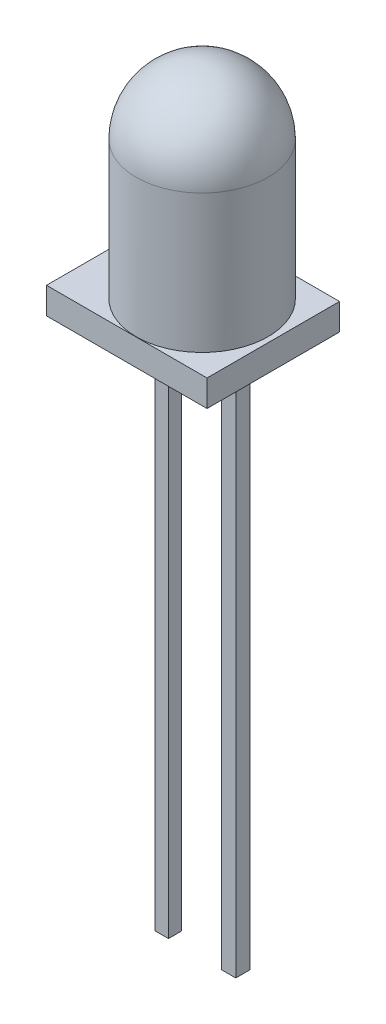
ISO-10303-21;
HEADER;
FILE_DESCRIPTION(('STEP AP214'),'2;1');
FILE_NAME('part.step','',(''),(''),'','','');
FILE_SCHEMA(('AUTOMOTIVE_DESIGN { 1 0 10303 214 1 1 1 1 }'));
ENDSEC;
DATA;
#1=APPLICATION_CONTEXT('core data for automotive mechanical design processes');
#2=APPLICATION_PROTOCOL_DEFINITION('international standard','automotive_design',2000,#1);
#3=PRODUCT_CONTEXT('',#1,'mechanical');
#4=PRODUCT('Part','Part','',(#3));
#5=PRODUCT_RELATED_PRODUCT_CATEGORY('part','',(#4));
#6=PRODUCT_DEFINITION_FORMATION('','',#4);
#7=PRODUCT_DEFINITION_CONTEXT('part definition',#1,'design');
#8=PRODUCT_DEFINITION('design','',#6,#7);
#9=PRODUCT_DEFINITION_SHAPE('','',#8);
#10=(LENGTH_UNIT() NAMED_UNIT(*) SI_UNIT(.MILLI.,.METRE.));
#11=(NAMED_UNIT(*) PLANE_ANGLE_UNIT() SI_UNIT($,.RADIAN.));
#12=(NAMED_UNIT(*) SI_UNIT($,.STERADIAN.) SOLID_ANGLE_UNIT());
#13=UNCERTAINTY_MEASURE_WITH_UNIT(LENGTH_MEASURE(1.E-05),#10,'distance_accuracy_value','');
#14=(GEOMETRIC_REPRESENTATION_CONTEXT(3) GLOBAL_UNCERTAINTY_ASSIGNED_CONTEXT((#13)) GLOBAL_UNIT_ASSIGNED_CONTEXT((#10,
#11,#12)) REPRESENTATION_CONTEXT('',''));
#15=CARTESIAN_POINT('',(0.,0.,0.));
#16=DIRECTION('',(0.,0.,1.));
#17=DIRECTION('',(1.,0.,0.));
#18=AXIS2_PLACEMENT_3D('',#15,#16,#17);
#19=CARTESIAN_POINT('',(2.68454649304317,-6.21,-2.5));
#20=DIRECTION('',(0.,-1.,0.));
#21=DIRECTION('',(1.,0.,0.));
#22=AXIS2_PLACEMENT_3D('',#19,#20,#21);
#23=PLANE('',#22);
#24=DIRECTION('',(1.,0.,0.));
#25=VECTOR('',#24,1.);
#26=CARTESIAN_POINT('',(2.68454649304317,-6.21,2.5));
#27=LINE('',#26,#25);
#28=CARTESIAN_POINT('',(-3.37328174981621,-6.21,2.5));
#29=VERTEX_POINT('',#28);
#30=CARTESIAN_POINT('',(2.68454649304317,-6.21,2.5));
#31=VERTEX_POINT('',#30);
#32=EDGE_CURVE('E186',#29,#31,#27,.T.);
#33=ORIENTED_EDGE('',*,*,#32,.F.);
#34=DIRECTION('',(0.,0.,1.));
#35=VECTOR('',#34,1.);
#36=CARTESIAN_POINT('',(-3.37328174981621,-6.21,-2.5));
#37=LINE('',#36,#35);
#38=CARTESIAN_POINT('',(-3.37328174981621,-6.21,-2.5));
#39=VERTEX_POINT('',#38);
#40=EDGE_CURVE('E208',#39,#29,#37,.T.);
#41=ORIENTED_EDGE('',*,*,#40,.F.);
#42=DIRECTION('',(1.,0.,0.));
#43=VECTOR('',#42,1.);
#44=CARTESIAN_POINT('',(2.68454649304317,-6.21,-2.5));
#45=LINE('',#44,#43);
#46=CARTESIAN_POINT('',(2.68454649304317,-6.21,-2.5));
#47=VERTEX_POINT('',#46);
#48=EDGE_CURVE('E192',#39,#47,#45,.T.);
#49=ORIENTED_EDGE('',*,*,#48,.T.);
#50=DIRECTION('',(0.,0.,1.));
#51=VECTOR('',#50,1.);
#52=CARTESIAN_POINT('',(2.68454649304317,-6.21,-2.5));
#53=LINE('',#52,#51);
#54=EDGE_CURVE('E206',#47,#31,#53,.T.);
#55=ORIENTED_EDGE('',*,*,#54,.T.);
#56=EDGE_LOOP('',(#33,#41,#49,#55));
#57=FACE_BOUND('',#56,.T.);
#58=DIRECTION('',(-1.,0.,0.));
#59=VECTOR('',#58,1.);
#60=CARTESIAN_POINT('',(-1.52,-6.21,0.25));
#61=LINE('',#60,#59);
#62=CARTESIAN_POINT('',(-1.02,-6.21,0.25));
#63=VERTEX_POINT('',#62);
#64=CARTESIAN_POINT('',(-1.52,-6.21,0.25));
#65=VERTEX_POINT('',#64);
#66=EDGE_CURVE('E153',#63,#65,#61,.T.);
#67=ORIENTED_EDGE('',*,*,#66,.F.);
#68=DIRECTION('',(0.,0.,1.));
#69=VECTOR('',#68,1.);
#70=CARTESIAN_POINT('',(-1.02,-6.21,-0.25));
#71=LINE('',#70,#69);
#72=CARTESIAN_POINT('',(-1.02,-6.21,-0.25));
#73=VERTEX_POINT('',#72);
#74=EDGE_CURVE('E150',#73,#63,#71,.T.);
#75=ORIENTED_EDGE('',*,*,#74,.F.);
#76=DIRECTION('',(1.,0.,0.));
#77=VECTOR('',#76,1.);
#78=CARTESIAN_POINT('',(-1.52,-6.21,-0.25));
#79=LINE('',#78,#77);
#80=CARTESIAN_POINT('',(-1.52,-6.21,-0.25));
#81=VERTEX_POINT('',#80);
#82=EDGE_CURVE('E162',#81,#73,#79,.T.);
#83=ORIENTED_EDGE('',*,*,#82,.F.);
#84=DIRECTION('',(0.,0.,-1.));
#85=VECTOR('',#84,1.);
#86=CARTESIAN_POINT('',(-1.52,-6.21,-0.25));
#87=LINE('',#86,#85);
#88=EDGE_CURVE('E170',#65,#81,#87,.T.);
#89=ORIENTED_EDGE('',*,*,#88,.F.);
#90=EDGE_LOOP('',(#67,#75,#83,#89));
#91=FACE_BOUND('',#90,.T.);
#92=DIRECTION('',(-1.,0.,0.));
#93=VECTOR('',#92,1.);
#94=CARTESIAN_POINT('',(1.00217363423916,-6.21,0.267826365760837));
#95=LINE('',#94,#93);
#96=CARTESIAN_POINT('',(1.53782636576084,-6.21,0.267826365760837));
#97=VERTEX_POINT('',#96);
#98=CARTESIAN_POINT('',(1.00217363423916,-6.21,0.267826365760837));
#99=VERTEX_POINT('',#98);
#100=EDGE_CURVE('E395',#97,#99,#95,.T.);
#101=ORIENTED_EDGE('',*,*,#100,.F.);
#102=DIRECTION('',(0.,0.,1.));
#103=VECTOR('',#102,1.);
#104=CARTESIAN_POINT('',(1.53782636576084,-6.21,-0.267826365760837));
#105=LINE('',#104,#103);
#106=CARTESIAN_POINT('',(1.53782636576084,-6.21,-0.267826365760837));
#107=VERTEX_POINT('',#106);
#108=EDGE_CURVE('E148',#107,#97,#105,.T.);
#109=ORIENTED_EDGE('',*,*,#108,.F.);
#110=DIRECTION('',(1.,0.,0.));
#111=VECTOR('',#110,1.);
#112=CARTESIAN_POINT('',(1.00217363423916,-6.21,-0.267826365760837));
#113=LINE('',#112,#111);
#114=CARTESIAN_POINT('',(1.00217363423916,-6.21,-0.267826365760837));
#115=VERTEX_POINT('',#114);
#116=EDGE_CURVE('E144',#115,#107,#113,.T.);
#117=ORIENTED_EDGE('',*,*,#116,.F.);
#118=DIRECTION('',(0.,0.,-1.));
#119=VECTOR('',#118,1.);
#120=CARTESIAN_POINT('',(1.00217363423916,-6.21,-0.267826365760837));
#121=LINE('',#120,#119);
#122=EDGE_CURVE('E392',#99,#115,#121,.T.);
#123=ORIENTED_EDGE('',*,*,#122,.F.);
#124=EDGE_LOOP('',(#101,#109,#117,#123));
#125=FACE_BOUND('',#124,.T.);
#126=ADVANCED_FACE('F35',(#57,#91,#125),#23,.T.);
#127=CARTESIAN_POINT('',(0.,2.49,0.));
#128=DIRECTION('',(0.,1.,0.));
#129=DIRECTION('',(-1.,0.,0.));
#130=AXIS2_PLACEMENT_3D('',#127,#128,#129);
#131=CYLINDRICAL_SURFACE('',#130,2.49);
#132=CARTESIAN_POINT('',(0.,-5.21,0.));
#133=DIRECTION('',(0.,1.,0.));
#134=DIRECTION('',(-1.,0.,0.));
#135=AXIS2_PLACEMENT_3D('',#132,#133,#134);
#136=CIRCLE('',#135,2.49);
#137=CARTESIAN_POINT('',(-2.49,-5.21,0.));
#138=VERTEX_POINT('',#137);
#139=EDGE_CURVE('E43',#138,#138,#136,.F.);
#140=ORIENTED_EDGE('',*,*,#139,.F.);
#141=EDGE_LOOP('',(#140));
#142=FACE_BOUND('',#141,.T.);
#143=CARTESIAN_POINT('',(0.,0.,0.));
#144=DIRECTION('',(0.,1.,0.));
#145=DIRECTION('',(-1.,0.,0.));
#146=AXIS2_PLACEMENT_3D('',#143,#144,#145);
#147=CIRCLE('',#146,2.49);
#148=CARTESIAN_POINT('',(-2.48999999999999,0.,0.));
#149=VERTEX_POINT('',#148);
#150=EDGE_CURVE('E11',#149,#149,#147,.T.);
#151=ORIENTED_EDGE('',*,*,#150,.F.);
#152=EDGE_LOOP('',(#151));
#153=FACE_BOUND('',#152,.T.);
#154=ADVANCED_FACE('F37',(#142,#153),#131,.T.);
#155=CARTESIAN_POINT('',(0.,0.,0.));
#156=DIRECTION('',(0.,1.,0.));
#157=DIRECTION('',(1.,0.,0.));
#158=AXIS2_PLACEMENT_3D('',#155,#156,#157);
#159=SPHERICAL_SURFACE('',#158,2.49);
#160=ORIENTED_EDGE('',*,*,#150,.T.);
#161=EDGE_LOOP('',(#160));
#162=FACE_BOUND('',#161,.T.);
#163=ADVANCED_FACE('F220',(#162),#159,.T.);
#164=CARTESIAN_POINT('',(2.68454649304317,-5.21,-2.5));
#165=DIRECTION('',(1.,0.,0.));
#166=DIRECTION('',(0.,0.,-1.));
#167=AXIS2_PLACEMENT_3D('',#164,#165,#166);
#168=PLANE('',#167);
#169=DIRECTION('',(0.,1.,0.));
#170=VECTOR('',#169,1.);
#171=CARTESIAN_POINT('',(2.68454649304317,-5.21,2.5));
#172=LINE('',#171,#170);
#173=CARTESIAN_POINT('',(2.68454649304317,-5.21,2.5));
#174=VERTEX_POINT('',#173);
#175=EDGE_CURVE('E181',#31,#174,#172,.T.);
#176=ORIENTED_EDGE('',*,*,#175,.F.);
#177=ORIENTED_EDGE('',*,*,#54,.F.);
#178=DIRECTION('',(0.,1.,0.));
#179=VECTOR('',#178,1.);
#180=CARTESIAN_POINT('',(2.68454649304317,-5.21,-2.5));
#181=LINE('',#180,#179);
#182=CARTESIAN_POINT('',(2.68454649304317,-5.21,-2.5));
#183=VERTEX_POINT('',#182);
#184=EDGE_CURVE('E182',#47,#183,#181,.T.);
#185=ORIENTED_EDGE('',*,*,#184,.T.);
#186=DIRECTION('',(0.,0.,1.));
#187=VECTOR('',#186,1.);
#188=CARTESIAN_POINT('',(2.68454649304317,-5.21,-2.5));
#189=LINE('',#188,#187);
#190=EDGE_CURVE('E195',#183,#174,#189,.T.);
#191=ORIENTED_EDGE('',*,*,#190,.T.);
#192=EDGE_LOOP('',(#176,#177,#185,#191));
#193=FACE_BOUND('',#192,.T.);
#194=ADVANCED_FACE('F224',(#193),#168,.T.);
#195=CARTESIAN_POINT('',(-3.37328174981621,-5.21,-2.5));
#196=DIRECTION('',(-1.,0.,0.));
#197=DIRECTION('',(0.,0.,1.));
#198=AXIS2_PLACEMENT_3D('',#195,#196,#197);
#199=PLANE('',#198);
#200=DIRECTION('',(0.,-1.,0.));
#201=VECTOR('',#200,1.);
#202=CARTESIAN_POINT('',(-3.37328174981621,-5.21,2.5));
#203=LINE('',#202,#201);
#204=CARTESIAN_POINT('',(-3.37328174981621,-5.21,2.5));
#205=VERTEX_POINT('',#204);
#206=EDGE_CURVE('E201',#205,#29,#203,.T.);
#207=ORIENTED_EDGE('',*,*,#206,.F.);
#208=DIRECTION('',(0.,0.,1.));
#209=VECTOR('',#208,1.);
#210=CARTESIAN_POINT('',(-3.37328174981621,-5.21,-2.5));
#211=LINE('',#210,#209);
#212=CARTESIAN_POINT('',(-3.37328174981621,-5.21,-2.5));
#213=VERTEX_POINT('',#212);
#214=EDGE_CURVE('E210',#213,#205,#211,.T.);
#215=ORIENTED_EDGE('',*,*,#214,.F.);
#216=DIRECTION('',(0.,-1.,0.));
#217=VECTOR('',#216,1.);
#218=CARTESIAN_POINT('',(-3.37328174981621,-5.21,-2.5));
#219=LINE('',#218,#217);
#220=EDGE_CURVE('E189',#213,#39,#219,.T.);
#221=ORIENTED_EDGE('',*,*,#220,.T.);
#222=ORIENTED_EDGE('',*,*,#40,.T.);
#223=EDGE_LOOP('',(#207,#215,#221,#222));
#224=FACE_BOUND('',#223,.T.);
#225=ADVANCED_FACE('F228',(#224),#199,.T.);
#226=CARTESIAN_POINT('',(2.68454649304317,-5.21,-2.5));
#227=DIRECTION('',(0.,1.,0.));
#228=DIRECTION('',(-1.,0.,0.));
#229=AXIS2_PLACEMENT_3D('',#226,#227,#228);
#230=PLANE('',#229);
#231=ORIENTED_EDGE('',*,*,#139,.T.);
#232=EDGE_LOOP('',(#231));
#233=FACE_BOUND('',#232,.T.);
#234=DIRECTION('',(-1.,0.,0.));
#235=VECTOR('',#234,1.);
#236=CARTESIAN_POINT('',(2.68454649304317,-5.21,2.5));
#237=LINE('',#236,#235);
#238=EDGE_CURVE('E198',#174,#205,#237,.T.);
#239=ORIENTED_EDGE('',*,*,#238,.F.);
#240=ORIENTED_EDGE('',*,*,#190,.F.);
#241=DIRECTION('',(-1.,0.,0.));
#242=VECTOR('',#241,1.);
#243=CARTESIAN_POINT('',(2.68454649304317,-5.21,-2.5));
#244=LINE('',#243,#242);
#245=EDGE_CURVE('E185',#183,#213,#244,.T.);
#246=ORIENTED_EDGE('',*,*,#245,.T.);
#247=ORIENTED_EDGE('',*,*,#214,.T.);
#248=EDGE_LOOP('',(#239,#240,#246,#247));
#249=FACE_BOUND('',#248,.T.);
#250=ADVANCED_FACE('F215',(#233,#249),#230,.T.);
#251=CARTESIAN_POINT('',(0.,0.,-2.5));
#252=DIRECTION('',(0.,0.,-1.));
#253=DIRECTION('',(-1.,0.,0.));
#254=AXIS2_PLACEMENT_3D('',#251,#252,#253);
#255=PLANE('',#254);
#256=ORIENTED_EDGE('',*,*,#184,.F.);
#257=ORIENTED_EDGE('',*,*,#48,.F.);
#258=ORIENTED_EDGE('',*,*,#220,.F.);
#259=ORIENTED_EDGE('',*,*,#245,.F.);
#260=EDGE_LOOP('',(#256,#257,#258,#259));
#261=FACE_BOUND('',#260,.T.);
#262=ADVANCED_FACE('F246',(#261),#255,.T.);
#263=CARTESIAN_POINT('',(0.,0.,2.5));
#264=DIRECTION('',(0.,0.,-1.));
#265=DIRECTION('',(-1.,0.,0.));
#266=AXIS2_PLACEMENT_3D('',#263,#264,#265);
#267=PLANE('',#266);
#268=ORIENTED_EDGE('',*,*,#175,.T.);
#269=ORIENTED_EDGE('',*,*,#238,.T.);
#270=ORIENTED_EDGE('',*,*,#206,.T.);
#271=ORIENTED_EDGE('',*,*,#32,.T.);
#272=EDGE_LOOP('',(#268,#269,#270,#271));
#273=FACE_BOUND('',#272,.T.);
#274=ADVANCED_FACE('F240',(#273),#267,.F.);
#275=CARTESIAN_POINT('',(-1.02,-26.51,-0.25));
#276=DIRECTION('',(-1.,0.,0.));
#277=DIRECTION('',(0.,-1.,0.));
#278=AXIS2_PLACEMENT_3D('',#275,#276,#277);
#279=PLANE('',#278);
#280=ORIENTED_EDGE('',*,*,#74,.T.);
#281=DIRECTION('',(0.,1.,0.));
#282=VECTOR('',#281,1.);
#283=CARTESIAN_POINT('',(-1.02,-26.51,0.25));
#284=LINE('',#283,#282);
#285=CARTESIAN_POINT('',(-1.02,-26.51,0.25));
#286=VERTEX_POINT('',#285);
#287=EDGE_CURVE('E179',#286,#63,#284,.T.);
#288=ORIENTED_EDGE('',*,*,#287,.F.);
#289=DIRECTION('',(0.,0.,1.));
#290=VECTOR('',#289,1.);
#291=CARTESIAN_POINT('',(-1.02,-26.51,-0.25));
#292=LINE('',#291,#290);
#293=CARTESIAN_POINT('',(-1.02,-26.51,-0.25));
#294=VERTEX_POINT('',#293);
#295=EDGE_CURVE('E158',#294,#286,#292,.T.);
#296=ORIENTED_EDGE('',*,*,#295,.F.);
#297=DIRECTION('',(0.,1.,0.));
#298=VECTOR('',#297,1.);
#299=CARTESIAN_POINT('',(-1.02,-26.51,-0.25));
#300=LINE('',#299,#298);
#301=EDGE_CURVE('E167',#294,#73,#300,.T.);
#302=ORIENTED_EDGE('',*,*,#301,.T.);
#303=EDGE_LOOP('',(#280,#288,#296,#302));
#304=FACE_BOUND('',#303,.T.);
#305=ADVANCED_FACE('F254',(#304),#279,.F.);
#306=CARTESIAN_POINT('',(-1.52,-26.51,0.25));
#307=DIRECTION('',(0.,0.,-1.));
#308=DIRECTION('',(-1.,0.,0.));
#309=AXIS2_PLACEMENT_3D('',#306,#307,#308);
#310=PLANE('',#309);
#311=ORIENTED_EDGE('',*,*,#66,.T.);
#312=DIRECTION('',(0.,1.,0.));
#313=VECTOR('',#312,1.);
#314=CARTESIAN_POINT('',(-1.52,-26.51,0.25));
#315=LINE('',#314,#313);
#316=CARTESIAN_POINT('',(-1.52,-26.51,0.25));
#317=VERTEX_POINT('',#316);
#318=EDGE_CURVE('E176',#317,#65,#315,.T.);
#319=ORIENTED_EDGE('',*,*,#318,.F.);
#320=DIRECTION('',(-1.,0.,0.));
#321=VECTOR('',#320,1.);
#322=CARTESIAN_POINT('',(-1.52,-26.51,0.25));
#323=LINE('',#322,#321);
#324=EDGE_CURVE('E161',#286,#317,#323,.T.);
#325=ORIENTED_EDGE('',*,*,#324,.F.);
#326=ORIENTED_EDGE('',*,*,#287,.T.);
#327=EDGE_LOOP('',(#311,#319,#325,#326));
#328=FACE_BOUND('',#327,.T.);
#329=ADVANCED_FACE('F260',(#328),#310,.F.);
#330=CARTESIAN_POINT('',(-1.52,-26.51,-0.25));
#331=DIRECTION('',(1.,0.,0.));
#332=DIRECTION('',(0.,1.,0.));
#333=AXIS2_PLACEMENT_3D('',#330,#331,#332);
#334=PLANE('',#333);
#335=ORIENTED_EDGE('',*,*,#88,.T.);
#336=DIRECTION('',(0.,1.,0.));
#337=VECTOR('',#336,1.);
#338=CARTESIAN_POINT('',(-1.52,-26.51,-0.25));
#339=LINE('',#338,#337);
#340=CARTESIAN_POINT('',(-1.52,-26.51,-0.25));
#341=VERTEX_POINT('',#340);
#342=EDGE_CURVE('E58',#341,#81,#339,.T.);
#343=ORIENTED_EDGE('',*,*,#342,.F.);
#344=DIRECTION('',(0.,0.,-1.));
#345=VECTOR('',#344,1.);
#346=CARTESIAN_POINT('',(-1.52,-26.51,-0.25));
#347=LINE('',#346,#345);
#348=EDGE_CURVE('E164',#317,#341,#347,.T.);
#349=ORIENTED_EDGE('',*,*,#348,.F.);
#350=ORIENTED_EDGE('',*,*,#318,.T.);
#351=EDGE_LOOP('',(#335,#343,#349,#350));
#352=FACE_BOUND('',#351,.T.);
#353=ADVANCED_FACE('F264',(#352),#334,.F.);
#354=CARTESIAN_POINT('',(-1.52,-26.51,-0.25));
#355=DIRECTION('',(0.,0.,1.));
#356=DIRECTION('',(1.,0.,0.));
#357=AXIS2_PLACEMENT_3D('',#354,#355,#356);
#358=PLANE('',#357);
#359=ORIENTED_EDGE('',*,*,#82,.T.);
#360=ORIENTED_EDGE('',*,*,#301,.F.);
#361=DIRECTION('',(1.,0.,0.));
#362=VECTOR('',#361,1.);
#363=CARTESIAN_POINT('',(-1.52,-26.51,-0.25));
#364=LINE('',#363,#362);
#365=EDGE_CURVE('E166',#341,#294,#364,.T.);
#366=ORIENTED_EDGE('',*,*,#365,.F.);
#367=ORIENTED_EDGE('',*,*,#342,.T.);
#368=EDGE_LOOP('',(#359,#360,#366,#367));
#369=FACE_BOUND('',#368,.T.);
#370=ADVANCED_FACE('F268',(#369),#358,.F.);
#371=CARTESIAN_POINT('',(0.,-26.51,0.));
#372=DIRECTION('',(0.,1.,0.));
#373=DIRECTION('',(0.,0.,1.));
#374=AXIS2_PLACEMENT_3D('',#371,#372,#373);
#375=PLANE('',#374);
#376=ORIENTED_EDGE('',*,*,#295,.T.);
#377=ORIENTED_EDGE('',*,*,#324,.T.);
#378=ORIENTED_EDGE('',*,*,#348,.T.);
#379=ORIENTED_EDGE('',*,*,#365,.T.);
#380=EDGE_LOOP('',(#376,#377,#378,#379));
#381=FACE_BOUND('',#380,.T.);
#382=ADVANCED_FACE('F272',(#381),#375,.F.);
#383=CARTESIAN_POINT('',(1.53782636576084,-26.51,-0.267826365760837));
#384=DIRECTION('',(-1.,0.,0.));
#385=DIRECTION('',(0.,-1.,0.));
#386=AXIS2_PLACEMENT_3D('',#383,#384,#385);
#387=PLANE('',#386);
#388=ORIENTED_EDGE('',*,*,#108,.T.);
#389=DIRECTION('',(0.,1.,0.));
#390=VECTOR('',#389,1.);
#391=CARTESIAN_POINT('',(1.53782636576084,-26.51,0.267826365760837));
#392=LINE('',#391,#390);
#393=CARTESIAN_POINT('',(1.53782636576084,-26.51,0.267826365760837));
#394=VERTEX_POINT('',#393);
#395=EDGE_CURVE('E129',#394,#97,#392,.T.);
#396=ORIENTED_EDGE('',*,*,#395,.F.);
#397=DIRECTION('',(0.,0.,1.));
#398=VECTOR('',#397,1.);
#399=CARTESIAN_POINT('',(1.53782636576084,-26.51,-0.267826365760837));
#400=LINE('',#399,#398);
#401=CARTESIAN_POINT('',(1.53782636576084,-26.51,-0.267826365760837));
#402=VERTEX_POINT('',#401);
#403=EDGE_CURVE('E136',#402,#394,#400,.T.);
#404=ORIENTED_EDGE('',*,*,#403,.F.);
#405=DIRECTION('',(0.,1.,0.));
#406=VECTOR('',#405,1.);
#407=CARTESIAN_POINT('',(1.53782636576084,-26.51,-0.267826365760837));
#408=LINE('',#407,#406);
#409=EDGE_CURVE('E389',#402,#107,#408,.T.);
#410=ORIENTED_EDGE('',*,*,#409,.T.);
#411=EDGE_LOOP('',(#388,#396,#404,#410));
#412=FACE_BOUND('',#411,.T.);
#413=ADVANCED_FACE('F146',(#412),#387,.F.);
#414=CARTESIAN_POINT('',(1.00217363423917,-26.51,0.267826365760837));
#415=DIRECTION('',(0.,0.,-1.));
#416=DIRECTION('',(-1.,0.,0.));
#417=AXIS2_PLACEMENT_3D('',#414,#415,#416);
#418=PLANE('',#417);
#419=ORIENTED_EDGE('',*,*,#100,.T.);
#420=DIRECTION('',(0.,1.,0.));
#421=VECTOR('',#420,1.);
#422=CARTESIAN_POINT('',(1.00217363423917,-26.51,0.267826365760837));
#423=LINE('',#422,#421);
#424=CARTESIAN_POINT('',(1.00217363423917,-26.51,0.267826365760837));
#425=VERTEX_POINT('',#424);
#426=EDGE_CURVE('E132',#425,#99,#423,.T.);
#427=ORIENTED_EDGE('',*,*,#426,.F.);
#428=DIRECTION('',(-1.,0.,0.));
#429=VECTOR('',#428,1.);
#430=CARTESIAN_POINT('',(1.00217363423917,-26.51,0.267826365760837));
#431=LINE('',#430,#429);
#432=EDGE_CURVE('E125',#394,#425,#431,.T.);
#433=ORIENTED_EDGE('',*,*,#432,.F.);
#434=ORIENTED_EDGE('',*,*,#395,.T.);
#435=EDGE_LOOP('',(#419,#427,#433,#434));
#436=FACE_BOUND('',#435,.T.);
#437=ADVANCED_FACE('F127',(#436),#418,.F.);
#438=CARTESIAN_POINT('',(1.00217363423917,-26.51,-0.267826365760837));
#439=DIRECTION('',(1.,0.,0.));
#440=DIRECTION('',(0.,1.,0.));
#441=AXIS2_PLACEMENT_3D('',#438,#439,#440);
#442=PLANE('',#441);
#443=ORIENTED_EDGE('',*,*,#122,.T.);
#444=DIRECTION('',(0.,1.,0.));
#445=VECTOR('',#444,1.);
#446=CARTESIAN_POINT('',(1.00217363423917,-26.51,-0.267826365760837));
#447=LINE('',#446,#445);
#448=CARTESIAN_POINT('',(1.00217363423917,-26.51,-0.267826365760837));
#449=VERTEX_POINT('',#448);
#450=EDGE_CURVE('E50',#449,#115,#447,.T.);
#451=ORIENTED_EDGE('',*,*,#450,.F.);
#452=DIRECTION('',(0.,0.,-1.));
#453=VECTOR('',#452,1.);
#454=CARTESIAN_POINT('',(1.00217363423917,-26.51,-0.267826365760837));
#455=LINE('',#454,#453);
#456=EDGE_CURVE('E135',#425,#449,#455,.T.);
#457=ORIENTED_EDGE('',*,*,#456,.F.);
#458=ORIENTED_EDGE('',*,*,#426,.T.);
#459=EDGE_LOOP('',(#443,#451,#457,#458));
#460=FACE_BOUND('',#459,.T.);
#461=ADVANCED_FACE('F280',(#460),#442,.F.);
#462=CARTESIAN_POINT('',(1.00217363423917,-26.51,-0.267826365760837));
#463=DIRECTION('',(0.,0.,1.));
#464=DIRECTION('',(1.,0.,0.));
#465=AXIS2_PLACEMENT_3D('',#462,#463,#464);
#466=PLANE('',#465);
#467=ORIENTED_EDGE('',*,*,#116,.T.);
#468=ORIENTED_EDGE('',*,*,#409,.F.);
#469=DIRECTION('',(1.,0.,0.));
#470=VECTOR('',#469,1.);
#471=CARTESIAN_POINT('',(1.00217363423917,-26.51,-0.267826365760837));
#472=LINE('',#471,#470);
#473=EDGE_CURVE('E140',#449,#402,#472,.T.);
#474=ORIENTED_EDGE('',*,*,#473,.F.);
#475=ORIENTED_EDGE('',*,*,#450,.T.);
#476=EDGE_LOOP('',(#467,#468,#474,#475));
#477=FACE_BOUND('',#476,.T.);
#478=ADVANCED_FACE('F283',(#477),#466,.F.);
#479=CARTESIAN_POINT('',(0.,-26.51,0.));
#480=DIRECTION('',(0.,1.,0.));
#481=DIRECTION('',(0.,0.,1.));
#482=AXIS2_PLACEMENT_3D('',#479,#480,#481);
#483=PLANE('',#482);
#484=ORIENTED_EDGE('',*,*,#403,.T.);
#485=ORIENTED_EDGE('',*,*,#432,.T.);
#486=ORIENTED_EDGE('',*,*,#456,.T.);
#487=ORIENTED_EDGE('',*,*,#473,.T.);
#488=EDGE_LOOP('',(#484,#485,#486,#487));
#489=FACE_BOUND('',#488,.T.);
#490=ADVANCED_FACE('F139',(#489),#483,.F.);
#491=CLOSED_SHELL('',(#126,#154,#163,#194,#225,#250,#262,#274,#305,#329,#353,#370,#382,#413,
#437,#461,#478,#490));
#492=MANIFOLD_SOLID_BREP('B2',#491);
#493=ADVANCED_BREP_SHAPE_REPRESENTATION('',(#18,#492),#14);
#494=SHAPE_DEFINITION_REPRESENTATION(#9,#493);
ENDSEC;
END-ISO-10303-21;
